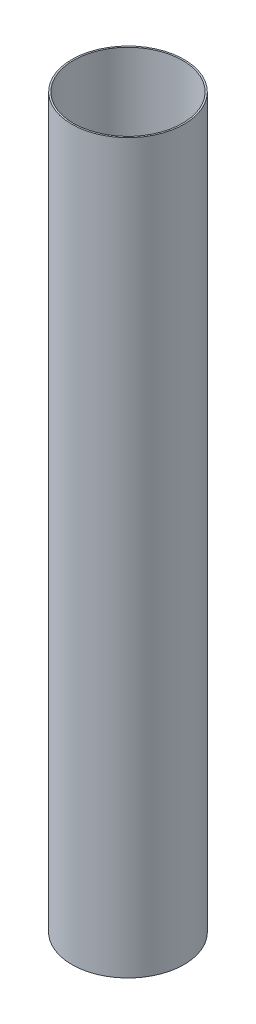
ISO-10303-21;
HEADER;
FILE_DESCRIPTION(('STEP AP214'),'2;1');
FILE_NAME('part.step','',(''),(''),'','','');
FILE_SCHEMA(('AUTOMOTIVE_DESIGN { 1 0 10303 214 1 1 1 1 }'));
ENDSEC;
DATA;
#1=APPLICATION_CONTEXT('core data for automotive mechanical design processes');
#2=APPLICATION_PROTOCOL_DEFINITION('international standard','automotive_design',2000,#1);
#3=PRODUCT_CONTEXT('',#1,'mechanical');
#4=PRODUCT('Part','Part','',(#3));
#5=PRODUCT_RELATED_PRODUCT_CATEGORY('part','',(#4));
#6=PRODUCT_DEFINITION_FORMATION('','',#4);
#7=PRODUCT_DEFINITION_CONTEXT('part definition',#1,'design');
#8=PRODUCT_DEFINITION('design','',#6,#7);
#9=PRODUCT_DEFINITION_SHAPE('','',#8);
#10=(LENGTH_UNIT() NAMED_UNIT(*) SI_UNIT(.MILLI.,.METRE.));
#11=(NAMED_UNIT(*) PLANE_ANGLE_UNIT() SI_UNIT($,.RADIAN.));
#12=(NAMED_UNIT(*) SI_UNIT($,.STERADIAN.) SOLID_ANGLE_UNIT());
#13=UNCERTAINTY_MEASURE_WITH_UNIT(LENGTH_MEASURE(1.E-05),#10,'distance_accuracy_value','');
#14=(GEOMETRIC_REPRESENTATION_CONTEXT(3) GLOBAL_UNCERTAINTY_ASSIGNED_CONTEXT((#13)) GLOBAL_UNIT_ASSIGNED_CONTEXT((#10,
#11,#12)) REPRESENTATION_CONTEXT('',''));
#15=CARTESIAN_POINT('',(0.,0.,0.));
#16=DIRECTION('',(0.,0.,1.));
#17=DIRECTION('',(1.,0.,0.));
#18=AXIS2_PLACEMENT_3D('',#15,#16,#17);
#19=CARTESIAN_POINT('',(0.,1016.,0.));
#20=DIRECTION('',(0.,1.,0.));
#21=DIRECTION('',(0.,0.,1.));
#22=AXIS2_PLACEMENT_3D('',#19,#20,#21);
#23=PLANE('',#22);
#24=CARTESIAN_POINT('',(0.,1016.,0.));
#25=DIRECTION('',(0.,1.,0.));
#26=DIRECTION('',(0.,0.,1.));
#27=AXIS2_PLACEMENT_3D('',#24,#25,#26);
#28=CIRCLE('',#27,78.359);
#29=CARTESIAN_POINT('',(0.,1016.,78.359));
#30=VERTEX_POINT('',#29);
#31=EDGE_CURVE('E10',#30,#30,#28,.T.);
#32=ORIENTED_EDGE('',*,*,#31,.T.);
#33=EDGE_LOOP('',(#32));
#34=FACE_BOUND('',#33,.T.);
#35=CARTESIAN_POINT('',(0.,1016.,0.));
#36=DIRECTION('',(0.,1.,0.));
#37=DIRECTION('',(0.,0.,1.));
#38=AXIS2_PLACEMENT_3D('',#35,#36,#37);
#39=CIRCLE('',#38,76.2);
#40=CARTESIAN_POINT('',(0.,1016.,76.2));
#41=VERTEX_POINT('',#40);
#42=EDGE_CURVE('E48',#41,#41,#39,.T.);
#43=ORIENTED_EDGE('',*,*,#42,.F.);
#44=EDGE_LOOP('',(#43));
#45=FACE_BOUND('',#44,.T.);
#46=ADVANCED_FACE('F37',(#34,#45),#23,.T.);
#47=CARTESIAN_POINT('',(0.,0.,0.));
#48=DIRECTION('',(0.,1.,0.));
#49=DIRECTION('',(0.,0.,1.));
#50=AXIS2_PLACEMENT_3D('',#47,#48,#49);
#51=PLANE('',#50);
#52=CARTESIAN_POINT('',(0.,0.,0.));
#53=DIRECTION('',(0.,1.,0.));
#54=DIRECTION('',(0.,0.,1.));
#55=AXIS2_PLACEMENT_3D('',#52,#53,#54);
#56=CIRCLE('',#55,78.359);
#57=CARTESIAN_POINT('',(0.,0.,78.359));
#58=VERTEX_POINT('',#57);
#59=EDGE_CURVE('E41',#58,#58,#56,.T.);
#60=ORIENTED_EDGE('',*,*,#59,.F.);
#61=EDGE_LOOP('',(#60));
#62=FACE_BOUND('',#61,.T.);
#63=CARTESIAN_POINT('',(0.,0.,0.));
#64=DIRECTION('',(0.,1.,0.));
#65=DIRECTION('',(0.,0.,1.));
#66=AXIS2_PLACEMENT_3D('',#63,#64,#65);
#67=CIRCLE('',#66,76.2);
#68=CARTESIAN_POINT('',(0.,0.,76.2));
#69=VERTEX_POINT('',#68);
#70=EDGE_CURVE('E50',#69,#69,#67,.T.);
#71=ORIENTED_EDGE('',*,*,#70,.T.);
#72=EDGE_LOOP('',(#71));
#73=FACE_BOUND('',#72,.T.);
#74=ADVANCED_FACE('F60',(#62,#73),#51,.F.);
#75=CARTESIAN_POINT('',(0.,1016.,0.));
#76=DIRECTION('',(0.,-1.,0.));
#77=DIRECTION('',(0.,0.,-1.));
#78=AXIS2_PLACEMENT_3D('',#75,#76,#77);
#79=CYLINDRICAL_SURFACE('',#78,78.359);
#80=ORIENTED_EDGE('',*,*,#31,.F.);
#81=EDGE_LOOP('',(#80));
#82=FACE_BOUND('',#81,.T.);
#83=ORIENTED_EDGE('',*,*,#59,.T.);
#84=EDGE_LOOP('',(#83));
#85=FACE_BOUND('',#84,.T.);
#86=ADVANCED_FACE('F39',(#82,#85),#79,.T.);
#87=CARTESIAN_POINT('',(0.,1016.,0.));
#88=DIRECTION('',(0.,-1.,0.));
#89=DIRECTION('',(0.,0.,-1.));
#90=AXIS2_PLACEMENT_3D('',#87,#88,#89);
#91=CYLINDRICAL_SURFACE('',#90,76.2);
#92=ORIENTED_EDGE('',*,*,#42,.T.);
#93=EDGE_LOOP('',(#92));
#94=FACE_BOUND('',#93,.T.);
#95=ORIENTED_EDGE('',*,*,#70,.F.);
#96=EDGE_LOOP('',(#95));
#97=FACE_BOUND('',#96,.T.);
#98=ADVANCED_FACE('F56',(#94,#97),#91,.F.);
#99=CLOSED_SHELL('',(#46,#74,#86,#98));
#100=MANIFOLD_SOLID_BREP('B2',#99);
#101=ADVANCED_BREP_SHAPE_REPRESENTATION('',(#18,#100),#14);
#102=SHAPE_DEFINITION_REPRESENTATION(#9,#101);
ENDSEC;
END-ISO-10303-21;
